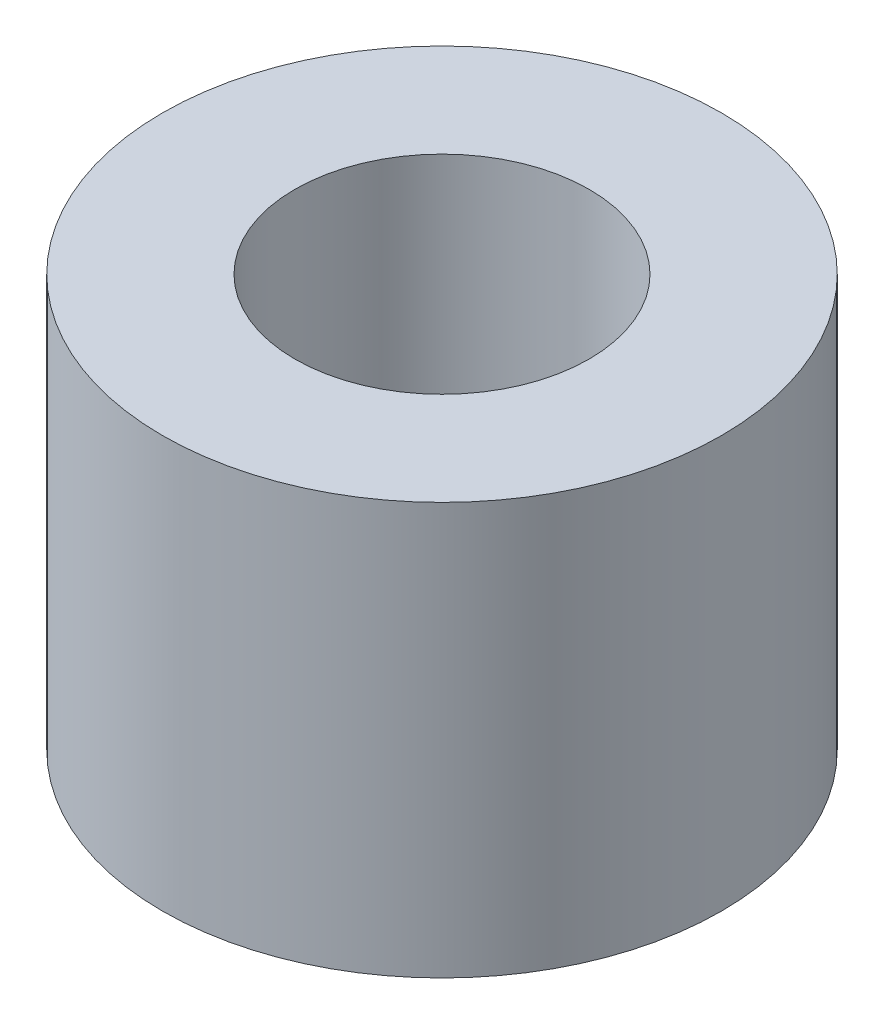
ISO-10303-21;
HEADER;
FILE_DESCRIPTION(('STEP AP214'),'2;1');
FILE_NAME('part.step','',(''),(''),'','','');
FILE_SCHEMA(('AUTOMOTIVE_DESIGN { 1 0 10303 214 1 1 1 1 }'));
ENDSEC;
DATA;
#1=APPLICATION_CONTEXT('core data for automotive mechanical design processes');
#2=APPLICATION_PROTOCOL_DEFINITION('international standard','automotive_design',2000,#1);
#3=PRODUCT_CONTEXT('',#1,'mechanical');
#4=PRODUCT('Part','Part','',(#3));
#5=PRODUCT_RELATED_PRODUCT_CATEGORY('part','',(#4));
#6=PRODUCT_DEFINITION_FORMATION('','',#4);
#7=PRODUCT_DEFINITION_CONTEXT('part definition',#1,'design');
#8=PRODUCT_DEFINITION('design','',#6,#7);
#9=PRODUCT_DEFINITION_SHAPE('','',#8);
#10=(LENGTH_UNIT() NAMED_UNIT(*) SI_UNIT(.MILLI.,.METRE.));
#11=(NAMED_UNIT(*) PLANE_ANGLE_UNIT() SI_UNIT($,.RADIAN.));
#12=(NAMED_UNIT(*) SI_UNIT($,.STERADIAN.) SOLID_ANGLE_UNIT());
#13=UNCERTAINTY_MEASURE_WITH_UNIT(LENGTH_MEASURE(1.E-05),#10,'distance_accuracy_value','');
#14=(GEOMETRIC_REPRESENTATION_CONTEXT(3) GLOBAL_UNCERTAINTY_ASSIGNED_CONTEXT((#13)) GLOBAL_UNIT_ASSIGNED_CONTEXT((#10,
#11,#12)) REPRESENTATION_CONTEXT('',''));
#15=CARTESIAN_POINT('',(0.,0.,0.));
#16=DIRECTION('',(0.,0.,1.));
#17=DIRECTION('',(1.,0.,0.));
#18=AXIS2_PLACEMENT_3D('',#15,#16,#17);
#19=CARTESIAN_POINT('',(0.,14.,0.));
#20=DIRECTION('',(0.,1.,0.));
#21=DIRECTION('',(0.,0.,1.));
#22=AXIS2_PLACEMENT_3D('',#19,#20,#21);
#23=PLANE('',#22);
#24=CARTESIAN_POINT('',(0.,14.,0.));
#25=DIRECTION('',(0.,1.,0.));
#26=DIRECTION('',(0.,0.,1.));
#27=AXIS2_PLACEMENT_3D('',#24,#25,#26);
#28=CIRCLE('',#27,9.5);
#29=CARTESIAN_POINT('',(0.,14.,9.5));
#30=VERTEX_POINT('',#29);
#31=EDGE_CURVE('E10',#30,#30,#28,.T.);
#32=ORIENTED_EDGE('',*,*,#31,.T.);
#33=EDGE_LOOP('',(#32));
#34=FACE_BOUND('',#33,.T.);
#35=CARTESIAN_POINT('',(0.,14.,0.));
#36=DIRECTION('',(0.,1.,0.));
#37=DIRECTION('',(0.,0.,1.));
#38=AXIS2_PLACEMENT_3D('',#35,#36,#37);
#39=CIRCLE('',#38,5.);
#40=CARTESIAN_POINT('',(0.,14.,5.));
#41=VERTEX_POINT('',#40);
#42=EDGE_CURVE('E46',#41,#41,#39,.T.);
#43=ORIENTED_EDGE('',*,*,#42,.F.);
#44=EDGE_LOOP('',(#43));
#45=FACE_BOUND('',#44,.T.);
#46=ADVANCED_FACE('F35',(#34,#45),#23,.T.);
#47=CARTESIAN_POINT('',(0.,0.,0.));
#48=DIRECTION('',(0.,1.,0.));
#49=DIRECTION('',(0.,0.,1.));
#50=AXIS2_PLACEMENT_3D('',#47,#48,#49);
#51=PLANE('',#50);
#52=CARTESIAN_POINT('',(0.,0.,0.));
#53=DIRECTION('',(0.,1.,0.));
#54=DIRECTION('',(0.,0.,1.));
#55=AXIS2_PLACEMENT_3D('',#52,#53,#54);
#56=CIRCLE('',#55,9.5);
#57=CARTESIAN_POINT('',(0.,0.,9.5));
#58=VERTEX_POINT('',#57);
#59=EDGE_CURVE('E39',#58,#58,#56,.T.);
#60=ORIENTED_EDGE('',*,*,#59,.F.);
#61=EDGE_LOOP('',(#60));
#62=FACE_BOUND('',#61,.T.);
#63=CARTESIAN_POINT('',(0.,0.,0.));
#64=DIRECTION('',(0.,1.,0.));
#65=DIRECTION('',(0.,0.,1.));
#66=AXIS2_PLACEMENT_3D('',#63,#64,#65);
#67=CIRCLE('',#66,5.);
#68=CARTESIAN_POINT('',(0.,0.,5.));
#69=VERTEX_POINT('',#68);
#70=EDGE_CURVE('E48',#69,#69,#67,.T.);
#71=ORIENTED_EDGE('',*,*,#70,.T.);
#72=EDGE_LOOP('',(#71));
#73=FACE_BOUND('',#72,.T.);
#74=ADVANCED_FACE('F58',(#62,#73),#51,.F.);
#75=CARTESIAN_POINT('',(0.,14.,0.));
#76=DIRECTION('',(0.,-1.,0.));
#77=DIRECTION('',(0.,0.,-1.));
#78=AXIS2_PLACEMENT_3D('',#75,#76,#77);
#79=CYLINDRICAL_SURFACE('',#78,9.5);
#80=ORIENTED_EDGE('',*,*,#31,.F.);
#81=EDGE_LOOP('',(#80));
#82=FACE_BOUND('',#81,.T.);
#83=ORIENTED_EDGE('',*,*,#59,.T.);
#84=EDGE_LOOP('',(#83));
#85=FACE_BOUND('',#84,.T.);
#86=ADVANCED_FACE('F37',(#82,#85),#79,.T.);
#87=CARTESIAN_POINT('',(0.,14.,0.));
#88=DIRECTION('',(0.,-1.,0.));
#89=DIRECTION('',(0.,0.,-1.));
#90=AXIS2_PLACEMENT_3D('',#87,#88,#89);
#91=CYLINDRICAL_SURFACE('',#90,5.);
#92=ORIENTED_EDGE('',*,*,#42,.T.);
#93=EDGE_LOOP('',(#92));
#94=FACE_BOUND('',#93,.T.);
#95=ORIENTED_EDGE('',*,*,#70,.F.);
#96=EDGE_LOOP('',(#95));
#97=FACE_BOUND('',#96,.T.);
#98=ADVANCED_FACE('F54',(#94,#97),#91,.F.);
#99=CLOSED_SHELL('',(#46,#74,#86,#98));
#100=MANIFOLD_SOLID_BREP('B2',#99);
#101=ADVANCED_BREP_SHAPE_REPRESENTATION('',(#18,#100),#14);
#102=SHAPE_DEFINITION_REPRESENTATION(#9,#101);
ENDSEC;
END-ISO-10303-21;
